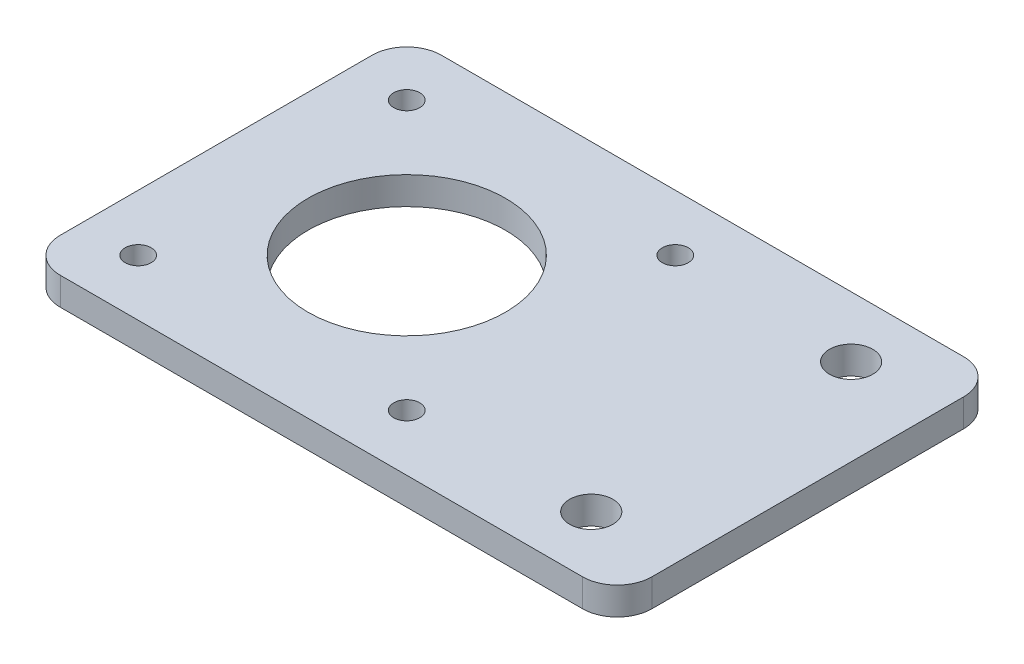
ISO-10303-21;
HEADER;
FILE_DESCRIPTION(('STEP AP214'),'2;1');
FILE_NAME('part.step','',(''),(''),'','','');
FILE_SCHEMA(('AUTOMOTIVE_DESIGN { 1 0 10303 214 1 1 1 1 }'));
ENDSEC;
DATA;
#1=APPLICATION_CONTEXT('core data for automotive mechanical design processes');
#2=APPLICATION_PROTOCOL_DEFINITION('international standard','automotive_design',2000,#1);
#3=PRODUCT_CONTEXT('',#1,'mechanical');
#4=PRODUCT('Part','Part','',(#3));
#5=PRODUCT_RELATED_PRODUCT_CATEGORY('part','',(#4));
#6=PRODUCT_DEFINITION_FORMATION('','',#4);
#7=PRODUCT_DEFINITION_CONTEXT('part definition',#1,'design');
#8=PRODUCT_DEFINITION('design','',#6,#7);
#9=PRODUCT_DEFINITION_SHAPE('','',#8);
#10=(LENGTH_UNIT() NAMED_UNIT(*) SI_UNIT(.MILLI.,.METRE.));
#11=(NAMED_UNIT(*) PLANE_ANGLE_UNIT() SI_UNIT($,.RADIAN.));
#12=(NAMED_UNIT(*) SI_UNIT($,.STERADIAN.) SOLID_ANGLE_UNIT());
#13=UNCERTAINTY_MEASURE_WITH_UNIT(LENGTH_MEASURE(1.E-05),#10,'distance_accuracy_value','');
#14=(GEOMETRIC_REPRESENTATION_CONTEXT(3) GLOBAL_UNCERTAINTY_ASSIGNED_CONTEXT((#13)) GLOBAL_UNIT_ASSIGNED_CONTEXT((#10,
#11,#12)) REPRESENTATION_CONTEXT('',''));
#15=CARTESIAN_POINT('',(0.,0.,0.));
#16=DIRECTION('',(0.,0.,1.));
#17=DIRECTION('',(1.,0.,0.));
#18=AXIS2_PLACEMENT_3D('',#15,#16,#17);
#19=CARTESIAN_POINT('',(34.15,3.2,-22.));
#20=DIRECTION('',(-1.,0.,0.));
#21=DIRECTION('',(0.,0.,1.));
#22=AXIS2_PLACEMENT_3D('',#19,#20,#21);
#23=PLANE('',#22);
#24=DIRECTION('',(0.,0.,-1.));
#25=VECTOR('',#24,1.);
#26=CARTESIAN_POINT('',(34.15,3.2,-22.));
#27=LINE('',#26,#25);
#28=CARTESIAN_POINT('',(34.15,3.2,18.));
#29=VERTEX_POINT('',#28);
#30=CARTESIAN_POINT('',(34.15,3.2,-18.));
#31=VERTEX_POINT('',#30);
#32=EDGE_CURVE('E118',#29,#31,#27,.T.);
#33=ORIENTED_EDGE('',*,*,#32,.F.);
#34=DIRECTION('',(0.,-1.,0.));
#35=VECTOR('',#34,1.);
#36=CARTESIAN_POINT('',(34.15,3.2,18.));
#37=LINE('',#36,#35);
#38=CARTESIAN_POINT('',(34.15,0.,18.));
#39=VERTEX_POINT('',#38);
#40=EDGE_CURVE('E103',#29,#39,#37,.T.);
#41=ORIENTED_EDGE('',*,*,#40,.T.);
#42=DIRECTION('',(0.,0.,-1.));
#43=VECTOR('',#42,1.);
#44=CARTESIAN_POINT('',(34.15,0.,-22.));
#45=LINE('',#44,#43);
#46=CARTESIAN_POINT('',(34.15,0.,-18.));
#47=VERTEX_POINT('',#46);
#48=EDGE_CURVE('E115',#39,#47,#45,.T.);
#49=ORIENTED_EDGE('',*,*,#48,.T.);
#50=DIRECTION('',(0.,-1.,0.));
#51=VECTOR('',#50,1.);
#52=CARTESIAN_POINT('',(34.15,3.2,-18.));
#53=LINE('',#52,#51);
#54=EDGE_CURVE('E120',#47,#31,#53,.F.);
#55=ORIENTED_EDGE('',*,*,#54,.T.);
#56=EDGE_LOOP('',(#33,#41,#49,#55));
#57=FACE_BOUND('',#56,.T.);
#58=ADVANCED_FACE('F33',(#57),#23,.F.);
#59=CARTESIAN_POINT('',(-34.15,3.2,-22.));
#60=DIRECTION('',(0.,0.,1.));
#61=DIRECTION('',(1.,0.,0.));
#62=AXIS2_PLACEMENT_3D('',#59,#60,#61);
#63=PLANE('',#62);
#64=DIRECTION('',(-1.,0.,0.));
#65=VECTOR('',#64,1.);
#66=CARTESIAN_POINT('',(-34.15,0.,-22.));
#67=LINE('',#66,#65);
#68=CARTESIAN_POINT('',(30.15,0.,-22.));
#69=VERTEX_POINT('',#68);
#70=CARTESIAN_POINT('',(-30.15,0.,-22.));
#71=VERTEX_POINT('',#70);
#72=EDGE_CURVE('E124',#69,#71,#67,.T.);
#73=ORIENTED_EDGE('',*,*,#72,.T.);
#74=DIRECTION('',(0.,-1.,0.));
#75=VECTOR('',#74,1.);
#76=CARTESIAN_POINT('',(-30.15,3.2,-22.));
#77=LINE('',#76,#75);
#78=CARTESIAN_POINT('',(-30.15,3.2,-22.));
#79=VERTEX_POINT('',#78);
#80=EDGE_CURVE('E11',#71,#79,#77,.F.);
#81=ORIENTED_EDGE('',*,*,#80,.T.);
#82=DIRECTION('',(-1.,0.,0.));
#83=VECTOR('',#82,1.);
#84=CARTESIAN_POINT('',(-34.15,3.2,-22.));
#85=LINE('',#84,#83);
#86=CARTESIAN_POINT('',(30.15,3.2,-22.));
#87=VERTEX_POINT('',#86);
#88=EDGE_CURVE('E164',#87,#79,#85,.T.);
#89=ORIENTED_EDGE('',*,*,#88,.F.);
#90=DIRECTION('',(0.,-1.,0.));
#91=VECTOR('',#90,1.);
#92=CARTESIAN_POINT('',(30.15,3.2,-22.));
#93=LINE('',#92,#91);
#94=EDGE_CURVE('E41',#87,#69,#93,.T.);
#95=ORIENTED_EDGE('',*,*,#94,.T.);
#96=EDGE_LOOP('',(#73,#81,#89,#95));
#97=FACE_BOUND('',#96,.T.);
#98=ADVANCED_FACE('F162',(#97),#63,.F.);
#99=CARTESIAN_POINT('',(-34.15,3.2,-22.));
#100=DIRECTION('',(1.,0.,0.));
#101=DIRECTION('',(0.,0.,-1.));
#102=AXIS2_PLACEMENT_3D('',#99,#100,#101);
#103=PLANE('',#102);
#104=DIRECTION('',(0.,0.,1.));
#105=VECTOR('',#104,1.);
#106=CARTESIAN_POINT('',(-34.15,0.,-22.));
#107=LINE('',#106,#105);
#108=CARTESIAN_POINT('',(-34.15,0.,-18.));
#109=VERTEX_POINT('',#108);
#110=CARTESIAN_POINT('',(-34.15,0.,18.));
#111=VERTEX_POINT('',#110);
#112=EDGE_CURVE('E128',#109,#111,#107,.T.);
#113=ORIENTED_EDGE('',*,*,#112,.T.);
#114=DIRECTION('',(0.,-1.,0.));
#115=VECTOR('',#114,1.);
#116=CARTESIAN_POINT('',(-34.15,3.2,18.));
#117=LINE('',#116,#115);
#118=CARTESIAN_POINT('',(-34.15,3.2,18.));
#119=VERTEX_POINT('',#118);
#120=EDGE_CURVE('E48',#111,#119,#117,.F.);
#121=ORIENTED_EDGE('',*,*,#120,.T.);
#122=DIRECTION('',(0.,0.,1.));
#123=VECTOR('',#122,1.);
#124=CARTESIAN_POINT('',(-34.15,3.2,-22.));
#125=LINE('',#124,#123);
#126=CARTESIAN_POINT('',(-34.15,3.2,-18.));
#127=VERTEX_POINT('',#126);
#128=EDGE_CURVE('E172',#127,#119,#125,.T.);
#129=ORIENTED_EDGE('',*,*,#128,.F.);
#130=DIRECTION('',(0.,-1.,0.));
#131=VECTOR('',#130,1.);
#132=CARTESIAN_POINT('',(-34.15,3.2,-18.));
#133=LINE('',#132,#131);
#134=EDGE_CURVE('E155',#127,#109,#133,.T.);
#135=ORIENTED_EDGE('',*,*,#134,.T.);
#136=EDGE_LOOP('',(#113,#121,#129,#135));
#137=FACE_BOUND('',#136,.T.);
#138=ADVANCED_FACE('F171',(#137),#103,.F.);
#139=CARTESIAN_POINT('',(-34.15,3.2,22.));
#140=DIRECTION('',(0.,0.,-1.));
#141=DIRECTION('',(-1.,0.,0.));
#142=AXIS2_PLACEMENT_3D('',#139,#140,#141);
#143=PLANE('',#142);
#144=DIRECTION('',(1.,0.,0.));
#145=VECTOR('',#144,1.);
#146=CARTESIAN_POINT('',(-34.15,0.,22.));
#147=LINE('',#146,#145);
#148=CARTESIAN_POINT('',(-30.15,0.,22.));
#149=VERTEX_POINT('',#148);
#150=CARTESIAN_POINT('',(30.15,0.,22.));
#151=VERTEX_POINT('',#150);
#152=EDGE_CURVE('E138',#149,#151,#147,.T.);
#153=ORIENTED_EDGE('',*,*,#152,.T.);
#154=DIRECTION('',(0.,-1.,0.));
#155=VECTOR('',#154,1.);
#156=CARTESIAN_POINT('',(30.15,3.2,22.));
#157=LINE('',#156,#155);
#158=CARTESIAN_POINT('',(30.15,3.2,22.));
#159=VERTEX_POINT('',#158);
#160=EDGE_CURVE('E104',#151,#159,#157,.F.);
#161=ORIENTED_EDGE('',*,*,#160,.T.);
#162=DIRECTION('',(1.,0.,0.));
#163=VECTOR('',#162,1.);
#164=CARTESIAN_POINT('',(-34.15,3.2,22.));
#165=LINE('',#164,#163);
#166=CARTESIAN_POINT('',(-30.15,3.2,22.));
#167=VERTEX_POINT('',#166);
#168=EDGE_CURVE('E134',#167,#159,#165,.T.);
#169=ORIENTED_EDGE('',*,*,#168,.F.);
#170=DIRECTION('',(0.,-1.,0.));
#171=VECTOR('',#170,1.);
#172=CARTESIAN_POINT('',(-30.15,3.2,22.));
#173=LINE('',#172,#171);
#174=EDGE_CURVE('E109',#167,#149,#173,.T.);
#175=ORIENTED_EDGE('',*,*,#174,.T.);
#176=EDGE_LOOP('',(#153,#161,#169,#175));
#177=FACE_BOUND('',#176,.T.);
#178=ADVANCED_FACE('F230',(#177),#143,.F.);
#179=CARTESIAN_POINT('',(0.,3.2,0.));
#180=DIRECTION('',(0.,1.,0.));
#181=DIRECTION('',(0.,0.,1.));
#182=AXIS2_PLACEMENT_3D('',#179,#180,#181);
#183=PLANE('',#182);
#184=CARTESIAN_POINT('',(24.15,3.2,-15.));
#185=DIRECTION('',(0.,1.,0.));
#186=DIRECTION('',(0.,0.,1.));
#187=AXIS2_PLACEMENT_3D('',#184,#185,#186);
#188=CIRCLE('',#187,2.5);
#189=CARTESIAN_POINT('',(24.15,3.2,-12.5));
#190=VERTEX_POINT('',#189);
#191=EDGE_CURVE('E200',#190,#190,#188,.T.);
#192=ORIENTED_EDGE('',*,*,#191,.F.);
#193=EDGE_LOOP('',(#192));
#194=FACE_BOUND('',#193,.T.);
#195=CARTESIAN_POINT('',(24.15,3.2,15.));
#196=DIRECTION('',(0.,1.,0.));
#197=DIRECTION('',(0.,0.,1.));
#198=AXIS2_PLACEMENT_3D('',#195,#196,#197);
#199=CIRCLE('',#198,2.5);
#200=CARTESIAN_POINT('',(24.15,3.2,17.5));
#201=VERTEX_POINT('',#200);
#202=EDGE_CURVE('E194',#201,#201,#199,.T.);
#203=ORIENTED_EDGE('',*,*,#202,.F.);
#204=EDGE_LOOP('',(#203));
#205=FACE_BOUND('',#204,.T.);
#206=CARTESIAN_POINT('',(-27.65,3.2,-15.5));
#207=DIRECTION('',(0.,1.,0.));
#208=DIRECTION('',(0.,0.,1.));
#209=AXIS2_PLACEMENT_3D('',#206,#207,#208);
#210=CIRCLE('',#209,1.5);
#211=CARTESIAN_POINT('',(-27.65,3.2,-14.));
#212=VERTEX_POINT('',#211);
#213=EDGE_CURVE('E188',#212,#212,#210,.T.);
#214=ORIENTED_EDGE('',*,*,#213,.F.);
#215=EDGE_LOOP('',(#214));
#216=FACE_BOUND('',#215,.T.);
#217=CARTESIAN_POINT('',(3.35000000000002,3.2,-15.5));
#218=DIRECTION('',(0.,1.,0.));
#219=DIRECTION('',(0.,0.,1.));
#220=AXIS2_PLACEMENT_3D('',#217,#218,#219);
#221=CIRCLE('',#220,1.5);
#222=CARTESIAN_POINT('',(3.35000000000002,3.2,-14.));
#223=VERTEX_POINT('',#222);
#224=EDGE_CURVE('E181',#223,#223,#221,.T.);
#225=ORIENTED_EDGE('',*,*,#224,.F.);
#226=EDGE_LOOP('',(#225));
#227=FACE_BOUND('',#226,.T.);
#228=CARTESIAN_POINT('',(3.35000000000002,3.2,15.5));
#229=DIRECTION('',(0.,1.,0.));
#230=DIRECTION('',(0.,0.,1.));
#231=AXIS2_PLACEMENT_3D('',#228,#229,#230);
#232=CIRCLE('',#231,1.5);
#233=CARTESIAN_POINT('',(3.35000000000002,3.2,17.));
#234=VERTEX_POINT('',#233);
#235=EDGE_CURVE('E211',#234,#234,#232,.T.);
#236=ORIENTED_EDGE('',*,*,#235,.F.);
#237=EDGE_LOOP('',(#236));
#238=FACE_BOUND('',#237,.T.);
#239=CARTESIAN_POINT('',(-27.65,3.2,15.5));
#240=DIRECTION('',(0.,1.,0.));
#241=DIRECTION('',(0.,0.,1.));
#242=AXIS2_PLACEMENT_3D('',#239,#240,#241);
#243=CIRCLE('',#242,1.5);
#244=CARTESIAN_POINT('',(-27.65,3.2,17.));
#245=VERTEX_POINT('',#244);
#246=EDGE_CURVE('E205',#245,#245,#243,.T.);
#247=ORIENTED_EDGE('',*,*,#246,.F.);
#248=EDGE_LOOP('',(#247));
#249=FACE_BOUND('',#248,.T.);
#250=CARTESIAN_POINT('',(-12.15,3.2,0.));
#251=DIRECTION('',(0.,1.,0.));
#252=DIRECTION('',(0.,0.,1.));
#253=AXIS2_PLACEMENT_3D('',#250,#251,#252);
#254=CIRCLE('',#253,11.4);
#255=CARTESIAN_POINT('',(-12.15,3.2,11.4));
#256=VERTEX_POINT('',#255);
#257=EDGE_CURVE('E131',#256,#256,#254,.T.);
#258=ORIENTED_EDGE('',*,*,#257,.F.);
#259=EDGE_LOOP('',(#258));
#260=FACE_BOUND('',#259,.T.);
#261=ORIENTED_EDGE('',*,*,#168,.T.);
#262=CARTESIAN_POINT('',(30.15,3.2,18.));
#263=DIRECTION('',(0.,1.,0.));
#264=DIRECTION('',(0.,0.,1.));
#265=AXIS2_PLACEMENT_3D('',#262,#263,#264);
#266=CIRCLE('',#265,4.);
#267=EDGE_CURVE('E153',#159,#29,#266,.T.);
#268=ORIENTED_EDGE('',*,*,#267,.T.);
#269=ORIENTED_EDGE('',*,*,#32,.T.);
#270=CARTESIAN_POINT('',(30.15,3.2,-18.));
#271=DIRECTION('',(0.,1.,0.));
#272=DIRECTION('',(0.,0.,1.));
#273=AXIS2_PLACEMENT_3D('',#270,#271,#272);
#274=CIRCLE('',#273,4.);
#275=EDGE_CURVE('E148',#31,#87,#274,.T.);
#276=ORIENTED_EDGE('',*,*,#275,.T.);
#277=ORIENTED_EDGE('',*,*,#88,.T.);
#278=CARTESIAN_POINT('',(-30.15,3.2,-18.));
#279=DIRECTION('',(0.,1.,0.));
#280=DIRECTION('',(0.,0.,1.));
#281=AXIS2_PLACEMENT_3D('',#278,#279,#280);
#282=CIRCLE('',#281,4.);
#283=EDGE_CURVE('E55',#79,#127,#282,.T.);
#284=ORIENTED_EDGE('',*,*,#283,.T.);
#285=ORIENTED_EDGE('',*,*,#128,.T.);
#286=CARTESIAN_POINT('',(-30.15,3.2,18.));
#287=DIRECTION('',(0.,1.,0.));
#288=DIRECTION('',(0.,0.,1.));
#289=AXIS2_PLACEMENT_3D('',#286,#287,#288);
#290=CIRCLE('',#289,4.);
#291=EDGE_CURVE('E151',#119,#167,#290,.T.);
#292=ORIENTED_EDGE('',*,*,#291,.T.);
#293=EDGE_LOOP('',(#261,#268,#269,#276,#277,#284,#285,#292));
#294=FACE_BOUND('',#293,.T.);
#295=ADVANCED_FACE('F227',(#194,#205,#216,#227,#238,#249,#260,#294),#183,.T.);
#296=CARTESIAN_POINT('',(0.,0.,0.));
#297=DIRECTION('',(0.,1.,0.));
#298=DIRECTION('',(0.,0.,1.));
#299=AXIS2_PLACEMENT_3D('',#296,#297,#298);
#300=PLANE('',#299);
#301=CARTESIAN_POINT('',(24.15,0.,-15.));
#302=DIRECTION('',(0.,1.,0.));
#303=DIRECTION('',(0.,0.,1.));
#304=AXIS2_PLACEMENT_3D('',#301,#302,#303);
#305=CIRCLE('',#304,2.5);
#306=CARTESIAN_POINT('',(24.15,0.,-12.5));
#307=VERTEX_POINT('',#306);
#308=EDGE_CURVE('E179',#307,#307,#305,.T.);
#309=ORIENTED_EDGE('',*,*,#308,.T.);
#310=EDGE_LOOP('',(#309));
#311=FACE_BOUND('',#310,.T.);
#312=CARTESIAN_POINT('',(24.15,0.,15.));
#313=DIRECTION('',(0.,1.,0.));
#314=DIRECTION('',(0.,0.,1.));
#315=AXIS2_PLACEMENT_3D('',#312,#313,#314);
#316=CIRCLE('',#315,2.5);
#317=CARTESIAN_POINT('',(24.15,0.,17.5));
#318=VERTEX_POINT('',#317);
#319=EDGE_CURVE('E197',#318,#318,#316,.T.);
#320=ORIENTED_EDGE('',*,*,#319,.T.);
#321=EDGE_LOOP('',(#320));
#322=FACE_BOUND('',#321,.T.);
#323=CARTESIAN_POINT('',(-27.65,0.,-15.5));
#324=DIRECTION('',(0.,1.,0.));
#325=DIRECTION('',(0.,0.,1.));
#326=AXIS2_PLACEMENT_3D('',#323,#324,#325);
#327=CIRCLE('',#326,1.5);
#328=CARTESIAN_POINT('',(-27.65,0.,-14.));
#329=VERTEX_POINT('',#328);
#330=EDGE_CURVE('E191',#329,#329,#327,.T.);
#331=ORIENTED_EDGE('',*,*,#330,.T.);
#332=EDGE_LOOP('',(#331));
#333=FACE_BOUND('',#332,.T.);
#334=CARTESIAN_POINT('',(3.35000000000002,0.,-15.5));
#335=DIRECTION('',(0.,1.,0.));
#336=DIRECTION('',(0.,0.,1.));
#337=AXIS2_PLACEMENT_3D('',#334,#335,#336);
#338=CIRCLE('',#337,1.5);
#339=CARTESIAN_POINT('',(3.35000000000002,0.,-14.));
#340=VERTEX_POINT('',#339);
#341=EDGE_CURVE('E184',#340,#340,#338,.T.);
#342=ORIENTED_EDGE('',*,*,#341,.T.);
#343=EDGE_LOOP('',(#342));
#344=FACE_BOUND('',#343,.T.);
#345=CARTESIAN_POINT('',(3.35000000000002,0.,15.5));
#346=DIRECTION('',(0.,1.,0.));
#347=DIRECTION('',(0.,0.,1.));
#348=AXIS2_PLACEMENT_3D('',#345,#346,#347);
#349=CIRCLE('',#348,1.5);
#350=CARTESIAN_POINT('',(3.35000000000002,0.,17.));
#351=VERTEX_POINT('',#350);
#352=EDGE_CURVE('E185',#351,#351,#349,.T.);
#353=ORIENTED_EDGE('',*,*,#352,.T.);
#354=EDGE_LOOP('',(#353));
#355=FACE_BOUND('',#354,.T.);
#356=CARTESIAN_POINT('',(-27.65,0.,15.5));
#357=DIRECTION('',(0.,1.,0.));
#358=DIRECTION('',(0.,0.,1.));
#359=AXIS2_PLACEMENT_3D('',#356,#357,#358);
#360=CIRCLE('',#359,1.5);
#361=CARTESIAN_POINT('',(-27.65,0.,17.));
#362=VERTEX_POINT('',#361);
#363=EDGE_CURVE('E208',#362,#362,#360,.T.);
#364=ORIENTED_EDGE('',*,*,#363,.T.);
#365=EDGE_LOOP('',(#364));
#366=FACE_BOUND('',#365,.T.);
#367=CARTESIAN_POINT('',(-12.15,0.,0.));
#368=DIRECTION('',(0.,1.,0.));
#369=DIRECTION('',(0.,0.,1.));
#370=AXIS2_PLACEMENT_3D('',#367,#368,#369);
#371=CIRCLE('',#370,11.4);
#372=CARTESIAN_POINT('',(-12.15,0.,11.4));
#373=VERTEX_POINT('',#372);
#374=EDGE_CURVE('E125',#373,#373,#371,.T.);
#375=ORIENTED_EDGE('',*,*,#374,.T.);
#376=EDGE_LOOP('',(#375));
#377=FACE_BOUND('',#376,.T.);
#378=ORIENTED_EDGE('',*,*,#48,.F.);
#379=CARTESIAN_POINT('',(30.15,0.,18.));
#380=DIRECTION('',(0.,1.,0.));
#381=DIRECTION('',(0.,0.,1.));
#382=AXIS2_PLACEMENT_3D('',#379,#380,#381);
#383=CIRCLE('',#382,4.);
#384=EDGE_CURVE('E99',#39,#151,#383,.F.);
#385=ORIENTED_EDGE('',*,*,#384,.T.);
#386=ORIENTED_EDGE('',*,*,#152,.F.);
#387=CARTESIAN_POINT('',(-30.15,0.,18.));
#388=DIRECTION('',(0.,1.,0.));
#389=DIRECTION('',(0.,0.,1.));
#390=AXIS2_PLACEMENT_3D('',#387,#388,#389);
#391=CIRCLE('',#390,4.);
#392=EDGE_CURVE('E110',#149,#111,#391,.F.);
#393=ORIENTED_EDGE('',*,*,#392,.T.);
#394=ORIENTED_EDGE('',*,*,#112,.F.);
#395=CARTESIAN_POINT('',(-30.15,0.,-18.));
#396=DIRECTION('',(0.,1.,0.));
#397=DIRECTION('',(0.,0.,1.));
#398=AXIS2_PLACEMENT_3D('',#395,#396,#397);
#399=CIRCLE('',#398,4.);
#400=EDGE_CURVE('E142',#109,#71,#399,.F.);
#401=ORIENTED_EDGE('',*,*,#400,.T.);
#402=ORIENTED_EDGE('',*,*,#72,.F.);
#403=CARTESIAN_POINT('',(30.15,0.,-18.));
#404=DIRECTION('',(0.,1.,0.));
#405=DIRECTION('',(0.,0.,1.));
#406=AXIS2_PLACEMENT_3D('',#403,#404,#405);
#407=CIRCLE('',#406,4.);
#408=EDGE_CURVE('E119',#69,#47,#407,.F.);
#409=ORIENTED_EDGE('',*,*,#408,.T.);
#410=EDGE_LOOP('',(#378,#385,#386,#393,#394,#401,#402,#409));
#411=FACE_BOUND('',#410,.T.);
#412=ADVANCED_FACE('F122',(#311,#322,#333,#344,#355,#366,#377,#411),#300,.F.);
#413=CARTESIAN_POINT('',(-12.15,0.,0.));
#414=DIRECTION('',(0.,1.,0.));
#415=DIRECTION('',(0.,0.,1.));
#416=AXIS2_PLACEMENT_3D('',#413,#414,#415);
#417=CYLINDRICAL_SURFACE('',#416,11.4);
#418=ORIENTED_EDGE('',*,*,#374,.F.);
#419=EDGE_LOOP('',(#418));
#420=FACE_BOUND('',#419,.T.);
#421=ORIENTED_EDGE('',*,*,#257,.T.);
#422=EDGE_LOOP('',(#421));
#423=FACE_BOUND('',#422,.T.);
#424=ADVANCED_FACE('F261',(#420,#423),#417,.F.);
#425=CARTESIAN_POINT('',(-27.65,0.,15.5));
#426=DIRECTION('',(0.,1.,0.));
#427=DIRECTION('',(0.,0.,1.));
#428=AXIS2_PLACEMENT_3D('',#425,#426,#427);
#429=CYLINDRICAL_SURFACE('',#428,1.5);
#430=ORIENTED_EDGE('',*,*,#363,.F.);
#431=EDGE_LOOP('',(#430));
#432=FACE_BOUND('',#431,.T.);
#433=ORIENTED_EDGE('',*,*,#246,.T.);
#434=EDGE_LOOP('',(#433));
#435=FACE_BOUND('',#434,.T.);
#436=ADVANCED_FACE('F223',(#432,#435),#429,.F.);
#437=CARTESIAN_POINT('',(3.35000000000002,0.,15.5));
#438=DIRECTION('',(0.,1.,0.));
#439=DIRECTION('',(0.,0.,1.));
#440=AXIS2_PLACEMENT_3D('',#437,#438,#439);
#441=CYLINDRICAL_SURFACE('',#440,1.5);
#442=ORIENTED_EDGE('',*,*,#352,.F.);
#443=EDGE_LOOP('',(#442));
#444=FACE_BOUND('',#443,.T.);
#445=ORIENTED_EDGE('',*,*,#235,.T.);
#446=EDGE_LOOP('',(#445));
#447=FACE_BOUND('',#446,.T.);
#448=ADVANCED_FACE('F219',(#444,#447),#441,.F.);
#449=CARTESIAN_POINT('',(3.35000000000002,0.,-15.5));
#450=DIRECTION('',(0.,1.,0.));
#451=DIRECTION('',(0.,0.,1.));
#452=AXIS2_PLACEMENT_3D('',#449,#450,#451);
#453=CYLINDRICAL_SURFACE('',#452,1.5);
#454=ORIENTED_EDGE('',*,*,#341,.F.);
#455=EDGE_LOOP('',(#454));
#456=FACE_BOUND('',#455,.T.);
#457=ORIENTED_EDGE('',*,*,#224,.T.);
#458=EDGE_LOOP('',(#457));
#459=FACE_BOUND('',#458,.T.);
#460=ADVANCED_FACE('F222',(#456,#459),#453,.F.);
#461=CARTESIAN_POINT('',(-27.65,0.,-15.5));
#462=DIRECTION('',(0.,1.,0.));
#463=DIRECTION('',(0.,0.,1.));
#464=AXIS2_PLACEMENT_3D('',#461,#462,#463);
#465=CYLINDRICAL_SURFACE('',#464,1.5);
#466=ORIENTED_EDGE('',*,*,#330,.F.);
#467=EDGE_LOOP('',(#466));
#468=FACE_BOUND('',#467,.T.);
#469=ORIENTED_EDGE('',*,*,#213,.T.);
#470=EDGE_LOOP('',(#469));
#471=FACE_BOUND('',#470,.T.);
#472=ADVANCED_FACE('F269',(#468,#471),#465,.F.);
#473=CARTESIAN_POINT('',(24.15,0.,15.));
#474=DIRECTION('',(0.,1.,0.));
#475=DIRECTION('',(0.,0.,1.));
#476=AXIS2_PLACEMENT_3D('',#473,#474,#475);
#477=CYLINDRICAL_SURFACE('',#476,2.5);
#478=ORIENTED_EDGE('',*,*,#319,.F.);
#479=EDGE_LOOP('',(#478));
#480=FACE_BOUND('',#479,.T.);
#481=ORIENTED_EDGE('',*,*,#202,.T.);
#482=EDGE_LOOP('',(#481));
#483=FACE_BOUND('',#482,.T.);
#484=ADVANCED_FACE('F273',(#480,#483),#477,.F.);
#485=CARTESIAN_POINT('',(24.15,0.,-15.));
#486=DIRECTION('',(0.,1.,0.));
#487=DIRECTION('',(0.,0.,1.));
#488=AXIS2_PLACEMENT_3D('',#485,#486,#487);
#489=CYLINDRICAL_SURFACE('',#488,2.5);
#490=ORIENTED_EDGE('',*,*,#308,.F.);
#491=EDGE_LOOP('',(#490));
#492=FACE_BOUND('',#491,.T.);
#493=ORIENTED_EDGE('',*,*,#191,.T.);
#494=EDGE_LOOP('',(#493));
#495=FACE_BOUND('',#494,.T.);
#496=ADVANCED_FACE('F247',(#492,#495),#489,.F.);
#497=CARTESIAN_POINT('',(30.15,3.2,18.));
#498=DIRECTION('',(0.,-1.,0.));
#499=DIRECTION('',(0.,0.,-1.));
#500=AXIS2_PLACEMENT_3D('',#497,#498,#499);
#501=CYLINDRICAL_SURFACE('',#500,4.);
#502=ORIENTED_EDGE('',*,*,#267,.F.);
#503=ORIENTED_EDGE('',*,*,#160,.F.);
#504=ORIENTED_EDGE('',*,*,#384,.F.);
#505=ORIENTED_EDGE('',*,*,#40,.F.);
#506=EDGE_LOOP('',(#502,#503,#504,#505));
#507=FACE_BOUND('',#506,.T.);
#508=ADVANCED_FACE('F102',(#507),#501,.T.);
#509=CARTESIAN_POINT('',(-30.15,3.2,18.));
#510=DIRECTION('',(0.,-1.,0.));
#511=DIRECTION('',(0.,0.,-1.));
#512=AXIS2_PLACEMENT_3D('',#509,#510,#511);
#513=CYLINDRICAL_SURFACE('',#512,4.);
#514=ORIENTED_EDGE('',*,*,#291,.F.);
#515=ORIENTED_EDGE('',*,*,#120,.F.);
#516=ORIENTED_EDGE('',*,*,#392,.F.);
#517=ORIENTED_EDGE('',*,*,#174,.F.);
#518=EDGE_LOOP('',(#514,#515,#516,#517));
#519=FACE_BOUND('',#518,.T.);
#520=ADVANCED_FACE('F240',(#519),#513,.T.);
#521=CARTESIAN_POINT('',(-30.15,3.2,-18.));
#522=DIRECTION('',(0.,-1.,0.));
#523=DIRECTION('',(0.,0.,-1.));
#524=AXIS2_PLACEMENT_3D('',#521,#522,#523);
#525=CYLINDRICAL_SURFACE('',#524,4.);
#526=ORIENTED_EDGE('',*,*,#283,.F.);
#527=ORIENTED_EDGE('',*,*,#80,.F.);
#528=ORIENTED_EDGE('',*,*,#400,.F.);
#529=ORIENTED_EDGE('',*,*,#134,.F.);
#530=EDGE_LOOP('',(#526,#527,#528,#529));
#531=FACE_BOUND('',#530,.T.);
#532=ADVANCED_FACE('F170',(#531),#525,.T.);
#533=CARTESIAN_POINT('',(30.15,3.2,-18.));
#534=DIRECTION('',(0.,-1.,0.));
#535=DIRECTION('',(0.,0.,-1.));
#536=AXIS2_PLACEMENT_3D('',#533,#534,#535);
#537=CYLINDRICAL_SURFACE('',#536,4.);
#538=ORIENTED_EDGE('',*,*,#275,.F.);
#539=ORIENTED_EDGE('',*,*,#54,.F.);
#540=ORIENTED_EDGE('',*,*,#408,.F.);
#541=ORIENTED_EDGE('',*,*,#94,.F.);
#542=EDGE_LOOP('',(#538,#539,#540,#541));
#543=FACE_BOUND('',#542,.T.);
#544=ADVANCED_FACE('F35',(#543),#537,.T.);
#545=CLOSED_SHELL('',(#58,#98,#138,#178,#295,#412,#424,#436,#448,#460,#472,#484,#496,#508,#520,
#532,#544));
#546=MANIFOLD_SOLID_BREP('B2',#545);
#547=ADVANCED_BREP_SHAPE_REPRESENTATION('',(#18,#546),#14);
#548=SHAPE_DEFINITION_REPRESENTATION(#9,#547);
ENDSEC;
END-ISO-10303-21;
